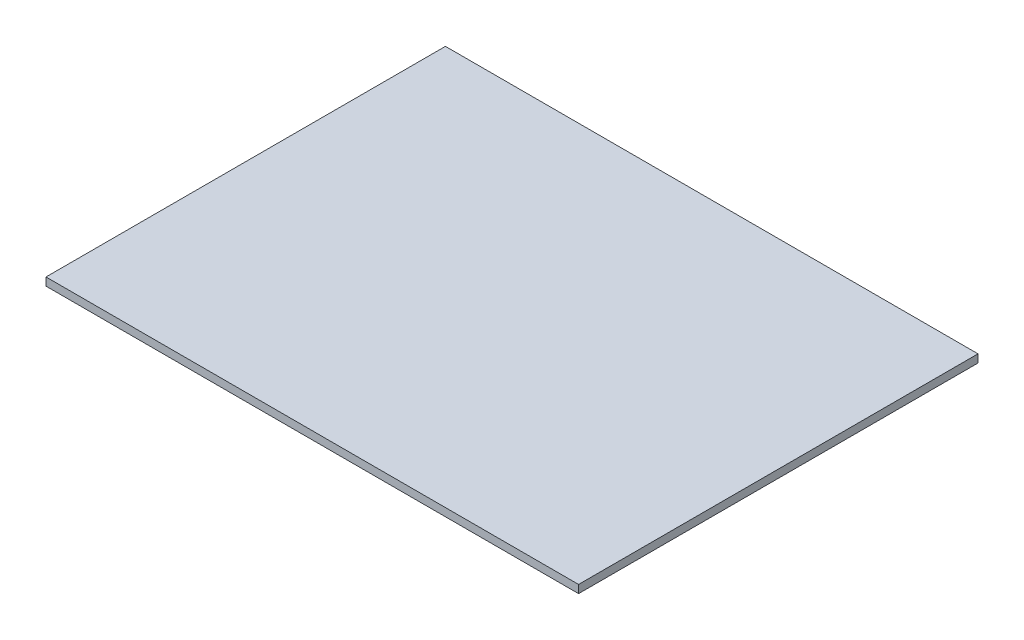
ISO-10303-21;
HEADER;
FILE_DESCRIPTION(('STEP AP214'),'2;1');
FILE_NAME('part.step','',(''),(''),'','','');
FILE_SCHEMA(('AUTOMOTIVE_DESIGN { 1 0 10303 214 1 1 1 1 }'));
ENDSEC;
DATA;
#1=APPLICATION_CONTEXT('core data for automotive mechanical design processes');
#2=APPLICATION_PROTOCOL_DEFINITION('international standard','automotive_design',2000,#1);
#3=PRODUCT_CONTEXT('',#1,'mechanical');
#4=PRODUCT('Part','Part','',(#3));
#5=PRODUCT_RELATED_PRODUCT_CATEGORY('part','',(#4));
#6=PRODUCT_DEFINITION_FORMATION('','',#4);
#7=PRODUCT_DEFINITION_CONTEXT('part definition',#1,'design');
#8=PRODUCT_DEFINITION('design','',#6,#7);
#9=PRODUCT_DEFINITION_SHAPE('','',#8);
#10=(LENGTH_UNIT() NAMED_UNIT(*) SI_UNIT(.MILLI.,.METRE.));
#11=(NAMED_UNIT(*) PLANE_ANGLE_UNIT() SI_UNIT($,.RADIAN.));
#12=(NAMED_UNIT(*) SI_UNIT($,.STERADIAN.) SOLID_ANGLE_UNIT());
#13=UNCERTAINTY_MEASURE_WITH_UNIT(LENGTH_MEASURE(1.E-05),#10,'distance_accuracy_value','');
#14=(GEOMETRIC_REPRESENTATION_CONTEXT(3) GLOBAL_UNCERTAINTY_ASSIGNED_CONTEXT((#13)) GLOBAL_UNIT_ASSIGNED_CONTEXT((#10,
#11,#12)) REPRESENTATION_CONTEXT('',''));
#15=CARTESIAN_POINT('',(0.,0.,0.));
#16=DIRECTION('',(0.,0.,1.));
#17=DIRECTION('',(1.,0.,0.));
#18=AXIS2_PLACEMENT_3D('',#15,#16,#17);
#19=CARTESIAN_POINT('',(0.,7.62,0.));
#20=DIRECTION('',(1.,0.,0.));
#21=DIRECTION('',(0.,0.,-1.));
#22=AXIS2_PLACEMENT_3D('',#19,#20,#21);
#23=PLANE('',#22);
#24=DIRECTION('',(0.,0.,1.));
#25=VECTOR('',#24,1.);
#26=CARTESIAN_POINT('',(0.,0.,0.));
#27=LINE('',#26,#25);
#28=CARTESIAN_POINT('',(0.,0.,0.));
#29=VERTEX_POINT('',#28);
#30=CARTESIAN_POINT('',(0.,0.,381.));
#31=VERTEX_POINT('',#30);
#32=EDGE_CURVE('E107',#29,#31,#27,.T.);
#33=ORIENTED_EDGE('',*,*,#32,.T.);
#34=DIRECTION('',(0.,-1.,0.));
#35=VECTOR('',#34,1.);
#36=CARTESIAN_POINT('',(0.,7.62,381.));
#37=LINE('',#36,#35);
#38=CARTESIAN_POINT('',(0.,7.62,381.));
#39=VERTEX_POINT('',#38);
#40=EDGE_CURVE('E11',#39,#31,#37,.T.);
#41=ORIENTED_EDGE('',*,*,#40,.F.);
#42=DIRECTION('',(0.,0.,1.));
#43=VECTOR('',#42,1.);
#44=CARTESIAN_POINT('',(0.,7.62,0.));
#45=LINE('',#44,#43);
#46=CARTESIAN_POINT('',(0.,7.62,0.));
#47=VERTEX_POINT('',#46);
#48=EDGE_CURVE('E91',#47,#39,#45,.T.);
#49=ORIENTED_EDGE('',*,*,#48,.F.);
#50=DIRECTION('',(0.,-1.,0.));
#51=VECTOR('',#50,1.);
#52=CARTESIAN_POINT('',(0.,7.62,0.));
#53=LINE('',#52,#51);
#54=EDGE_CURVE('E103',#47,#29,#53,.T.);
#55=ORIENTED_EDGE('',*,*,#54,.T.);
#56=EDGE_LOOP('',(#33,#41,#49,#55));
#57=FACE_BOUND('',#56,.T.);
#58=ADVANCED_FACE('F39',(#57),#23,.F.);
#59=CARTESIAN_POINT('',(0.,7.62,381.));
#60=DIRECTION('',(0.,0.,-1.));
#61=DIRECTION('',(-1.,0.,0.));
#62=AXIS2_PLACEMENT_3D('',#59,#60,#61);
#63=PLANE('',#62);
#64=DIRECTION('',(1.,0.,0.));
#65=VECTOR('',#64,1.);
#66=CARTESIAN_POINT('',(0.,0.,381.));
#67=LINE('',#66,#65);
#68=CARTESIAN_POINT('',(508.,0.,381.));
#69=VERTEX_POINT('',#68);
#70=EDGE_CURVE('E96',#31,#69,#67,.T.);
#71=ORIENTED_EDGE('',*,*,#70,.T.);
#72=DIRECTION('',(0.,-1.,0.));
#73=VECTOR('',#72,1.);
#74=CARTESIAN_POINT('',(508.,7.62,381.));
#75=LINE('',#74,#73);
#76=CARTESIAN_POINT('',(508.,7.62,381.));
#77=VERTEX_POINT('',#76);
#78=EDGE_CURVE('E48',#77,#69,#75,.T.);
#79=ORIENTED_EDGE('',*,*,#78,.F.);
#80=DIRECTION('',(1.,0.,0.));
#81=VECTOR('',#80,1.);
#82=CARTESIAN_POINT('',(0.,7.62,381.));
#83=LINE('',#82,#81);
#84=EDGE_CURVE('E86',#39,#77,#83,.T.);
#85=ORIENTED_EDGE('',*,*,#84,.F.);
#86=ORIENTED_EDGE('',*,*,#40,.T.);
#87=EDGE_LOOP('',(#71,#79,#85,#86));
#88=FACE_BOUND('',#87,.T.);
#89=ADVANCED_FACE('F95',(#88),#63,.F.);
#90=CARTESIAN_POINT('',(508.,7.62,0.));
#91=DIRECTION('',(-1.,0.,0.));
#92=DIRECTION('',(0.,0.,1.));
#93=AXIS2_PLACEMENT_3D('',#90,#91,#92);
#94=PLANE('',#93);
#95=DIRECTION('',(0.,0.,-1.));
#96=VECTOR('',#95,1.);
#97=CARTESIAN_POINT('',(508.,0.,0.));
#98=LINE('',#97,#96);
#99=CARTESIAN_POINT('',(508.,0.,0.));
#100=VERTEX_POINT('',#99);
#101=EDGE_CURVE('E73',#69,#100,#98,.T.);
#102=ORIENTED_EDGE('',*,*,#101,.T.);
#103=DIRECTION('',(0.,-1.,0.));
#104=VECTOR('',#103,1.);
#105=CARTESIAN_POINT('',(508.,7.62,0.));
#106=LINE('',#105,#104);
#107=CARTESIAN_POINT('',(508.,7.62,0.));
#108=VERTEX_POINT('',#107);
#109=EDGE_CURVE('E98',#108,#100,#106,.T.);
#110=ORIENTED_EDGE('',*,*,#109,.F.);
#111=DIRECTION('',(0.,0.,-1.));
#112=VECTOR('',#111,1.);
#113=CARTESIAN_POINT('',(508.,7.62,0.));
#114=LINE('',#113,#112);
#115=EDGE_CURVE('E89',#77,#108,#114,.T.);
#116=ORIENTED_EDGE('',*,*,#115,.F.);
#117=ORIENTED_EDGE('',*,*,#78,.T.);
#118=EDGE_LOOP('',(#102,#110,#116,#117));
#119=FACE_BOUND('',#118,.T.);
#120=ADVANCED_FACE('F99',(#119),#94,.F.);
#121=CARTESIAN_POINT('',(0.,7.62,0.));
#122=DIRECTION('',(0.,0.,1.));
#123=DIRECTION('',(1.,0.,0.));
#124=AXIS2_PLACEMENT_3D('',#121,#122,#123);
#125=PLANE('',#124);
#126=DIRECTION('',(-1.,0.,0.));
#127=VECTOR('',#126,1.);
#128=CARTESIAN_POINT('',(0.,0.,0.));
#129=LINE('',#128,#127);
#130=EDGE_CURVE('E79',#100,#29,#129,.T.);
#131=ORIENTED_EDGE('',*,*,#130,.T.);
#132=ORIENTED_EDGE('',*,*,#54,.F.);
#133=DIRECTION('',(-1.,0.,0.));
#134=VECTOR('',#133,1.);
#135=CARTESIAN_POINT('',(0.,7.62,0.));
#136=LINE('',#135,#134);
#137=EDGE_CURVE('E56',#108,#47,#136,.T.);
#138=ORIENTED_EDGE('',*,*,#137,.F.);
#139=ORIENTED_EDGE('',*,*,#109,.T.);
#140=EDGE_LOOP('',(#131,#132,#138,#139));
#141=FACE_BOUND('',#140,.T.);
#142=ADVANCED_FACE('F120',(#141),#125,.F.);
#143=CARTESIAN_POINT('',(0.,7.62,0.));
#144=DIRECTION('',(0.,1.,0.));
#145=DIRECTION('',(0.,0.,1.));
#146=AXIS2_PLACEMENT_3D('',#143,#144,#145);
#147=PLANE('',#146);
#148=ORIENTED_EDGE('',*,*,#48,.T.);
#149=ORIENTED_EDGE('',*,*,#84,.T.);
#150=ORIENTED_EDGE('',*,*,#115,.T.);
#151=ORIENTED_EDGE('',*,*,#137,.T.);
#152=EDGE_LOOP('',(#148,#149,#150,#151));
#153=FACE_BOUND('',#152,.T.);
#154=ADVANCED_FACE('F87',(#153),#147,.T.);
#155=CARTESIAN_POINT('',(0.,0.,0.));
#156=DIRECTION('',(0.,1.,0.));
#157=DIRECTION('',(0.,0.,1.));
#158=AXIS2_PLACEMENT_3D('',#155,#156,#157);
#159=PLANE('',#158);
#160=ORIENTED_EDGE('',*,*,#32,.F.);
#161=ORIENTED_EDGE('',*,*,#130,.F.);
#162=ORIENTED_EDGE('',*,*,#101,.F.);
#163=ORIENTED_EDGE('',*,*,#70,.F.);
#164=EDGE_LOOP('',(#160,#161,#162,#163));
#165=FACE_BOUND('',#164,.T.);
#166=ADVANCED_FACE('F123',(#165),#159,.F.);
#167=CLOSED_SHELL('',(#58,#89,#120,#142,#154,#166));
#168=MANIFOLD_SOLID_BREP('B2',#167);
#169=ADVANCED_BREP_SHAPE_REPRESENTATION('',(#18,#168),#14);
#170=SHAPE_DEFINITION_REPRESENTATION(#9,#169);
ENDSEC;
END-ISO-10303-21;
